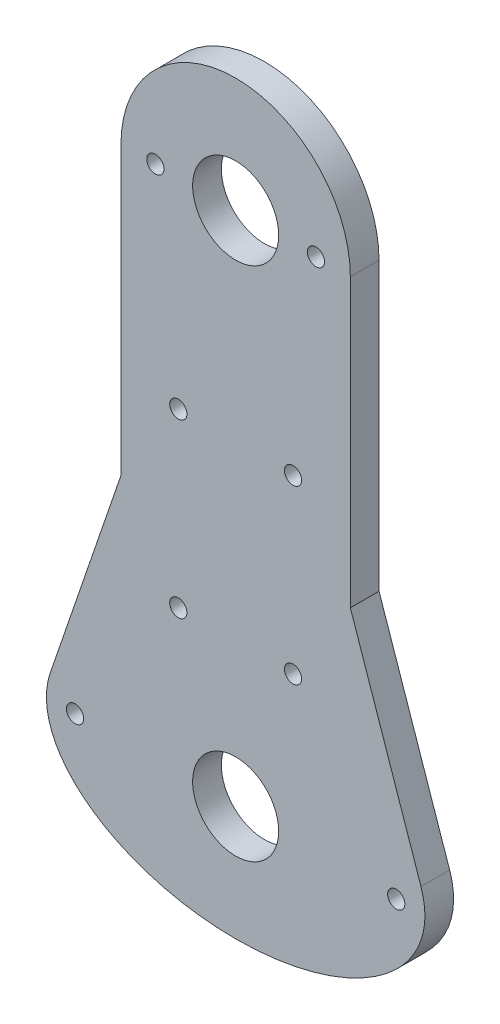
ISO-10303-21;
HEADER;
FILE_DESCRIPTION(('STEP AP214'),'2;1');
FILE_NAME('part.step','',(''),(''),'','','');
FILE_SCHEMA(('AUTOMOTIVE_DESIGN { 1 0 10303 214 1 1 1 1 }'));
ENDSEC;
DATA;
#1=APPLICATION_CONTEXT('core data for automotive mechanical design processes');
#2=APPLICATION_PROTOCOL_DEFINITION('international standard','automotive_design',2000,#1);
#3=PRODUCT_CONTEXT('',#1,'mechanical');
#4=PRODUCT('Part','Part','',(#3));
#5=PRODUCT_RELATED_PRODUCT_CATEGORY('part','',(#4));
#6=PRODUCT_DEFINITION_FORMATION('','',#4);
#7=PRODUCT_DEFINITION_CONTEXT('part definition',#1,'design');
#8=PRODUCT_DEFINITION('design','',#6,#7);
#9=PRODUCT_DEFINITION_SHAPE('','',#8);
#10=(LENGTH_UNIT() NAMED_UNIT(*) SI_UNIT(.MILLI.,.METRE.));
#11=(NAMED_UNIT(*) PLANE_ANGLE_UNIT() SI_UNIT($,.RADIAN.));
#12=(NAMED_UNIT(*) SI_UNIT($,.STERADIAN.) SOLID_ANGLE_UNIT());
#13=UNCERTAINTY_MEASURE_WITH_UNIT(LENGTH_MEASURE(1.E-05),#10,'distance_accuracy_value','');
#14=(GEOMETRIC_REPRESENTATION_CONTEXT(3) GLOBAL_UNCERTAINTY_ASSIGNED_CONTEXT((#13)) GLOBAL_UNIT_ASSIGNED_CONTEXT((#10,
#11,#12)) REPRESENTATION_CONTEXT('',''));
#15=CARTESIAN_POINT('',(0.,0.,0.));
#16=DIRECTION('',(0.,0.,1.));
#17=DIRECTION('',(1.,0.,0.));
#18=AXIS2_PLACEMENT_3D('',#15,#16,#17);
#19=CARTESIAN_POINT('',(2.5687062530529,0.880028463017288,5.));
#20=DIRECTION('',(0.946021715179054,0.324103246527525,0.));
#21=DIRECTION('',(-0.324103246527525,0.946021715179054,0.));
#22=AXIS2_PLACEMENT_3D('',#19,#20,#21);
#23=PLANE('',#22);
#24=DIRECTION('',(0.324103246527525,-0.946021715179054,0.));
#25=VECTOR('',#24,1.);
#26=CARTESIAN_POINT('',(2.5687062530529,0.880028463017288,0.));
#27=LINE('',#26,#25);
#28=CARTESIAN_POINT('',(20.,-50.,0.));
#29=VERTEX_POINT('',#28);
#30=CARTESIAN_POINT('',(32.3108587123528,-85.9340420041052,0.));
#31=VERTEX_POINT('',#30);
#32=EDGE_CURVE('E210',#29,#31,#27,.T.);
#33=ORIENTED_EDGE('',*,*,#32,.F.);
#34=DIRECTION('',(0.,0.,-1.));
#35=VECTOR('',#34,1.);
#36=CARTESIAN_POINT('',(20.,-50.,5.));
#37=LINE('',#36,#35);
#38=CARTESIAN_POINT('',(20.,-50.,5.));
#39=VERTEX_POINT('',#38);
#40=EDGE_CURVE('E73',#39,#29,#37,.T.);
#41=ORIENTED_EDGE('',*,*,#40,.F.);
#42=DIRECTION('',(-0.324103246527525,0.946021715179054,0.));
#43=VECTOR('',#42,1.);
#44=CARTESIAN_POINT('',(2.5687062530529,0.880028463017288,5.));
#45=LINE('',#44,#43);
#46=CARTESIAN_POINT('',(32.3108587123528,-85.9340420041052,5.));
#47=VERTEX_POINT('',#46);
#48=EDGE_CURVE('E140',#39,#47,#45,.F.);
#49=ORIENTED_EDGE('',*,*,#48,.T.);
#50=DIRECTION('',(0.,0.,-1.));
#51=VECTOR('',#50,1.);
#52=CARTESIAN_POINT('',(32.3108587123528,-85.9340420041052,5.));
#53=LINE('',#52,#51);
#54=EDGE_CURVE('E13',#47,#31,#53,.T.);
#55=ORIENTED_EDGE('',*,*,#54,.T.);
#56=EDGE_LOOP('',(#33,#41,#49,#55));
#57=FACE_BOUND('',#56,.T.);
#58=ADVANCED_FACE('F61',(#57),#23,.T.);
#59=CARTESIAN_POINT('',(20.,0.,5.));
#60=DIRECTION('',(1.,0.,0.));
#61=DIRECTION('',(0.,0.,-1.));
#62=AXIS2_PLACEMENT_3D('',#59,#60,#61);
#63=PLANE('',#62);
#64=DIRECTION('',(0.,-1.,0.));
#65=VECTOR('',#64,1.);
#66=CARTESIAN_POINT('',(20.,0.,0.));
#67=LINE('',#66,#65);
#68=CARTESIAN_POINT('',(20.,0.,0.));
#69=VERTEX_POINT('',#68);
#70=EDGE_CURVE('E214',#69,#29,#67,.T.);
#71=ORIENTED_EDGE('',*,*,#70,.F.);
#72=DIRECTION('',(0.,0.,-1.));
#73=VECTOR('',#72,1.);
#74=CARTESIAN_POINT('',(20.,0.,5.));
#75=LINE('',#74,#73);
#76=CARTESIAN_POINT('',(20.,0.,5.));
#77=VERTEX_POINT('',#76);
#78=EDGE_CURVE('E131',#77,#69,#75,.T.);
#79=ORIENTED_EDGE('',*,*,#78,.F.);
#80=DIRECTION('',(0.,1.,0.));
#81=VECTOR('',#80,1.);
#82=CARTESIAN_POINT('',(20.,0.,5.));
#83=LINE('',#82,#81);
#84=EDGE_CURVE('E121',#77,#39,#83,.F.);
#85=ORIENTED_EDGE('',*,*,#84,.T.);
#86=ORIENTED_EDGE('',*,*,#40,.T.);
#87=EDGE_LOOP('',(#71,#79,#85,#86));
#88=FACE_BOUND('',#87,.T.);
#89=ADVANCED_FACE('F201',(#88),#63,.T.);
#90=CARTESIAN_POINT('',(0.,0.,5.));
#91=DIRECTION('',(0.,0.,-1.));
#92=DIRECTION('',(-1.,0.,0.));
#93=AXIS2_PLACEMENT_3D('',#90,#91,#92);
#94=CYLINDRICAL_SURFACE('',#93,20.);
#95=CARTESIAN_POINT('',(0.,0.,0.));
#96=DIRECTION('',(0.,0.,1.));
#97=DIRECTION('',(1.,0.,0.));
#98=AXIS2_PLACEMENT_3D('',#95,#96,#97);
#99=CIRCLE('',#98,20.);
#100=CARTESIAN_POINT('',(-20.,0.,0.));
#101=VERTEX_POINT('',#100);
#102=EDGE_CURVE('E128',#69,#101,#99,.T.);
#103=ORIENTED_EDGE('',*,*,#102,.T.);
#104=DIRECTION('',(0.,0.,-1.));
#105=VECTOR('',#104,1.);
#106=CARTESIAN_POINT('',(-20.,0.,5.));
#107=LINE('',#106,#105);
#108=CARTESIAN_POINT('',(-20.,0.,5.));
#109=VERTEX_POINT('',#108);
#110=EDGE_CURVE('E125',#109,#101,#107,.T.);
#111=ORIENTED_EDGE('',*,*,#110,.F.);
#112=CARTESIAN_POINT('',(0.,0.,5.));
#113=DIRECTION('',(0.,0.,-1.));
#114=DIRECTION('',(-1.,0.,0.));
#115=AXIS2_PLACEMENT_3D('',#112,#113,#114);
#116=CIRCLE('',#115,20.);
#117=EDGE_CURVE('E113',#77,#109,#116,.F.);
#118=ORIENTED_EDGE('',*,*,#117,.F.);
#119=ORIENTED_EDGE('',*,*,#78,.T.);
#120=EDGE_LOOP('',(#103,#111,#118,#119));
#121=FACE_BOUND('',#120,.T.);
#122=ADVANCED_FACE('F126',(#121),#94,.T.);
#123=CARTESIAN_POINT('',(-20.,0.,5.));
#124=DIRECTION('',(1.,0.,0.));
#125=DIRECTION('',(0.,0.,-1.));
#126=AXIS2_PLACEMENT_3D('',#123,#124,#125);
#127=PLANE('',#126);
#128=DIRECTION('',(0.,-1.,0.));
#129=VECTOR('',#128,1.);
#130=CARTESIAN_POINT('',(-20.,0.,0.));
#131=LINE('',#130,#129);
#132=CARTESIAN_POINT('',(-20.,-50.,0.));
#133=VERTEX_POINT('',#132);
#134=EDGE_CURVE('E218',#101,#133,#131,.T.);
#135=ORIENTED_EDGE('',*,*,#134,.T.);
#136=DIRECTION('',(0.,0.,-1.));
#137=VECTOR('',#136,1.);
#138=CARTESIAN_POINT('',(-20.,-50.,5.));
#139=LINE('',#138,#137);
#140=CARTESIAN_POINT('',(-20.,-50.,5.));
#141=VERTEX_POINT('',#140);
#142=EDGE_CURVE('E132',#141,#133,#139,.T.);
#143=ORIENTED_EDGE('',*,*,#142,.F.);
#144=DIRECTION('',(0.,1.,0.));
#145=VECTOR('',#144,1.);
#146=CARTESIAN_POINT('',(-20.,0.,5.));
#147=LINE('',#146,#145);
#148=EDGE_CURVE('E117',#109,#141,#147,.F.);
#149=ORIENTED_EDGE('',*,*,#148,.F.);
#150=ORIENTED_EDGE('',*,*,#110,.T.);
#151=EDGE_LOOP('',(#135,#143,#149,#150));
#152=FACE_BOUND('',#151,.T.);
#153=ADVANCED_FACE('F134',(#152),#127,.F.);
#154=CARTESIAN_POINT('',(-2.5687062530529,0.880028463017288,5.));
#155=DIRECTION('',(0.946021715179054,-0.324103246527525,0.));
#156=DIRECTION('',(0.324103246527525,0.946021715179054,0.));
#157=AXIS2_PLACEMENT_3D('',#154,#155,#156);
#158=PLANE('',#157);
#159=DIRECTION('',(-0.324103246527525,-0.946021715179054,0.));
#160=VECTOR('',#159,1.);
#161=CARTESIAN_POINT('',(-2.5687062530529,0.880028463017288,0.));
#162=LINE('',#161,#160);
#163=CARTESIAN_POINT('',(-32.3108587123528,-85.9340420041052,0.));
#164=VERTEX_POINT('',#163);
#165=EDGE_CURVE('E222',#133,#164,#162,.T.);
#166=ORIENTED_EDGE('',*,*,#165,.T.);
#167=DIRECTION('',(0.,0.,-1.));
#168=VECTOR('',#167,1.);
#169=CARTESIAN_POINT('',(-32.3108587123528,-85.9340420041052,5.));
#170=LINE('',#169,#168);
#171=CARTESIAN_POINT('',(-32.3108587123528,-85.9340420041052,5.));
#172=VERTEX_POINT('',#171);
#173=EDGE_CURVE('E137',#172,#164,#170,.T.);
#174=ORIENTED_EDGE('',*,*,#173,.F.);
#175=DIRECTION('',(-0.324103246527525,-0.946021715179053,0.));
#176=VECTOR('',#175,1.);
#177=CARTESIAN_POINT('',(-20.,-50.,5.));
#178=LINE('',#177,#176);
#179=EDGE_CURVE('E81',#141,#172,#178,.T.);
#180=ORIENTED_EDGE('',*,*,#179,.F.);
#181=ORIENTED_EDGE('',*,*,#142,.T.);
#182=EDGE_LOOP('',(#166,#174,#180,#181));
#183=FACE_BOUND('',#182,.T.);
#184=ADVANCED_FACE('F193',(#183),#158,.F.);
#185=CARTESIAN_POINT('',(0.,-90.,5.));
#186=DIRECTION('',(0.,0.,1.));
#187=DIRECTION('',(-1.,0.,0.));
#188=AXIS2_PLACEMENT_3D('',#185,#186,#187);
#189=ELLIPSE('',#188,33.,20.);
#190=DIRECTION('',(0.,0.,-1.));
#191=VECTOR('',#190,1.);
#192=SURFACE_OF_LINEAR_EXTRUSION('',#189,#191);
#193=ORIENTED_EDGE('',*,*,#54,.F.);
#194=CARTESIAN_POINT('',(0.,-90.,5.));
#195=DIRECTION('',(0.,0.,-1.));
#196=DIRECTION('',(-1.,0.,0.));
#197=AXIS2_PLACEMENT_3D('',#194,#195,#196);
#198=ELLIPSE('',#197,33.,20.);
#199=EDGE_CURVE('E145',#172,#47,#198,.F.);
#200=ORIENTED_EDGE('',*,*,#199,.F.);
#201=ORIENTED_EDGE('',*,*,#173,.T.);
#202=CARTESIAN_POINT('',(0.,-90.,0.));
#203=DIRECTION('',(0.,0.,1.));
#204=DIRECTION('',(-1.,0.,0.));
#205=AXIS2_PLACEMENT_3D('',#202,#203,#204);
#206=ELLIPSE('',#205,33.,20.);
#207=EDGE_CURVE('E152',#164,#31,#206,.T.);
#208=ORIENTED_EDGE('',*,*,#207,.T.);
#209=EDGE_LOOP('',(#193,#200,#201,#208));
#210=FACE_BOUND('',#209,.T.);
#211=ADVANCED_FACE('F63',(#210),#192,.F.);
#212=CARTESIAN_POINT('',(0.,0.,0.));
#213=DIRECTION('',(0.,0.,1.));
#214=DIRECTION('',(1.,0.,0.));
#215=AXIS2_PLACEMENT_3D('',#212,#213,#214);
#216=PLANE('',#215);
#217=CARTESIAN_POINT('',(28.,-90.,0.));
#218=DIRECTION('',(0.,0.,1.));
#219=DIRECTION('',(1.,0.,0.));
#220=AXIS2_PLACEMENT_3D('',#217,#218,#219);
#221=CIRCLE('',#220,1.5);
#222=CARTESIAN_POINT('',(29.5,-90.,0.));
#223=VERTEX_POINT('',#222);
#224=EDGE_CURVE('E234',#223,#223,#221,.F.);
#225=ORIENTED_EDGE('',*,*,#224,.F.);
#226=EDGE_LOOP('',(#225));
#227=FACE_BOUND('',#226,.T.);
#228=CARTESIAN_POINT('',(-28.,-90.,0.));
#229=DIRECTION('',(0.,0.,1.));
#230=DIRECTION('',(1.,0.,0.));
#231=AXIS2_PLACEMENT_3D('',#228,#229,#230);
#232=CIRCLE('',#231,1.5);
#233=CARTESIAN_POINT('',(-26.5,-90.,0.));
#234=VERTEX_POINT('',#233);
#235=EDGE_CURVE('E265',#234,#234,#232,.F.);
#236=ORIENTED_EDGE('',*,*,#235,.F.);
#237=EDGE_LOOP('',(#236));
#238=FACE_BOUND('',#237,.T.);
#239=CARTESIAN_POINT('',(-10.,-65.,0.));
#240=DIRECTION('',(0.,0.,1.));
#241=DIRECTION('',(1.,0.,0.));
#242=AXIS2_PLACEMENT_3D('',#239,#240,#241);
#243=CIRCLE('',#242,1.5);
#244=CARTESIAN_POINT('',(-8.50000000000003,-65.,0.));
#245=VERTEX_POINT('',#244);
#246=EDGE_CURVE('E264',#245,#245,#243,.F.);
#247=ORIENTED_EDGE('',*,*,#246,.F.);
#248=EDGE_LOOP('',(#247));
#249=FACE_BOUND('',#248,.T.);
#250=CARTESIAN_POINT('',(-10.,-35.,0.));
#251=DIRECTION('',(0.,0.,1.));
#252=DIRECTION('',(1.,0.,0.));
#253=AXIS2_PLACEMENT_3D('',#250,#251,#252);
#254=CIRCLE('',#253,1.5);
#255=CARTESIAN_POINT('',(-8.5,-35.,0.));
#256=VERTEX_POINT('',#255);
#257=EDGE_CURVE('E271',#256,#256,#254,.F.);
#258=ORIENTED_EDGE('',*,*,#257,.F.);
#259=EDGE_LOOP('',(#258));
#260=FACE_BOUND('',#259,.T.);
#261=CARTESIAN_POINT('',(14.,0.,0.));
#262=DIRECTION('',(0.,0.,1.));
#263=DIRECTION('',(1.,0.,0.));
#264=AXIS2_PLACEMENT_3D('',#261,#262,#263);
#265=CIRCLE('',#264,1.5);
#266=CARTESIAN_POINT('',(15.5,0.,0.));
#267=VERTEX_POINT('',#266);
#268=EDGE_CURVE('E238',#267,#267,#265,.F.);
#269=ORIENTED_EDGE('',*,*,#268,.F.);
#270=EDGE_LOOP('',(#269));
#271=FACE_BOUND('',#270,.T.);
#272=CARTESIAN_POINT('',(10.,-35.,0.));
#273=DIRECTION('',(0.,0.,1.));
#274=DIRECTION('',(1.,0.,0.));
#275=AXIS2_PLACEMENT_3D('',#272,#273,#274);
#276=CIRCLE('',#275,1.5);
#277=CARTESIAN_POINT('',(11.5,-35.,0.));
#278=VERTEX_POINT('',#277);
#279=EDGE_CURVE('E239',#278,#278,#276,.F.);
#280=ORIENTED_EDGE('',*,*,#279,.F.);
#281=EDGE_LOOP('',(#280));
#282=FACE_BOUND('',#281,.T.);
#283=CARTESIAN_POINT('',(10.,-65.,0.));
#284=DIRECTION('',(0.,0.,1.));
#285=DIRECTION('',(1.,0.,0.));
#286=AXIS2_PLACEMENT_3D('',#283,#284,#285);
#287=CIRCLE('',#286,1.5);
#288=CARTESIAN_POINT('',(11.5,-65.,0.));
#289=VERTEX_POINT('',#288);
#290=EDGE_CURVE('E252',#289,#289,#287,.F.);
#291=ORIENTED_EDGE('',*,*,#290,.F.);
#292=EDGE_LOOP('',(#291));
#293=FACE_BOUND('',#292,.T.);
#294=CARTESIAN_POINT('',(-14.,0.,0.));
#295=DIRECTION('',(0.,0.,1.));
#296=DIRECTION('',(1.,0.,0.));
#297=AXIS2_PLACEMENT_3D('',#294,#295,#296);
#298=CIRCLE('',#297,1.5);
#299=CARTESIAN_POINT('',(-12.5,0.,0.));
#300=VERTEX_POINT('',#299);
#301=EDGE_CURVE('E253',#300,#300,#298,.F.);
#302=ORIENTED_EDGE('',*,*,#301,.F.);
#303=EDGE_LOOP('',(#302));
#304=FACE_BOUND('',#303,.T.);
#305=CARTESIAN_POINT('',(0.,0.,0.));
#306=DIRECTION('',(0.,0.,1.));
#307=DIRECTION('',(1.,0.,0.));
#308=AXIS2_PLACEMENT_3D('',#305,#306,#307);
#309=CIRCLE('',#308,7.5);
#310=CARTESIAN_POINT('',(7.5,0.,0.));
#311=VERTEX_POINT('',#310);
#312=EDGE_CURVE('E228',#311,#311,#309,.T.);
#313=ORIENTED_EDGE('',*,*,#312,.T.);
#314=EDGE_LOOP('',(#313));
#315=FACE_BOUND('',#314,.T.);
#316=CARTESIAN_POINT('',(0.,-90.,0.));
#317=DIRECTION('',(0.,0.,1.));
#318=DIRECTION('',(1.,0.,0.));
#319=AXIS2_PLACEMENT_3D('',#316,#317,#318);
#320=CIRCLE('',#319,7.5);
#321=CARTESIAN_POINT('',(7.5,-90.,0.));
#322=VERTEX_POINT('',#321);
#323=EDGE_CURVE('E153',#322,#322,#320,.T.);
#324=ORIENTED_EDGE('',*,*,#323,.T.);
#325=EDGE_LOOP('',(#324));
#326=FACE_BOUND('',#325,.T.);
#327=ORIENTED_EDGE('',*,*,#32,.T.);
#328=ORIENTED_EDGE('',*,*,#207,.F.);
#329=ORIENTED_EDGE('',*,*,#165,.F.);
#330=ORIENTED_EDGE('',*,*,#134,.F.);
#331=ORIENTED_EDGE('',*,*,#102,.F.);
#332=ORIENTED_EDGE('',*,*,#70,.T.);
#333=EDGE_LOOP('',(#327,#328,#329,#330,#331,#332));
#334=FACE_BOUND('',#333,.T.);
#335=ADVANCED_FACE('F187',(#227,#238,#249,#260,#271,#282,#293,#304,#315,#326,#334),#216,.F.);
#336=CARTESIAN_POINT('',(0.,0.,5.));
#337=DIRECTION('',(0.,0.,1.));
#338=DIRECTION('',(1.,0.,0.));
#339=AXIS2_PLACEMENT_3D('',#336,#337,#338);
#340=PLANE('',#339);
#341=CARTESIAN_POINT('',(28.,-90.,5.));
#342=DIRECTION('',(0.,0.,1.));
#343=DIRECTION('',(1.,0.,0.));
#344=AXIS2_PLACEMENT_3D('',#341,#342,#343);
#345=CIRCLE('',#344,1.5);
#346=CARTESIAN_POINT('',(29.5,-90.,5.));
#347=VERTEX_POINT('',#346);
#348=EDGE_CURVE('E246',#347,#347,#345,.T.);
#349=ORIENTED_EDGE('',*,*,#348,.F.);
#350=EDGE_LOOP('',(#349));
#351=FACE_BOUND('',#350,.T.);
#352=CARTESIAN_POINT('',(-28.,-90.,5.));
#353=DIRECTION('',(0.,0.,1.));
#354=DIRECTION('',(-1.,0.,0.));
#355=AXIS2_PLACEMENT_3D('',#352,#353,#354);
#356=CIRCLE('',#355,1.5);
#357=CARTESIAN_POINT('',(-29.5,-90.,5.));
#358=VERTEX_POINT('',#357);
#359=EDGE_CURVE('E261',#358,#358,#356,.T.);
#360=ORIENTED_EDGE('',*,*,#359,.F.);
#361=EDGE_LOOP('',(#360));
#362=FACE_BOUND('',#361,.T.);
#363=CARTESIAN_POINT('',(-10.,-65.,5.));
#364=DIRECTION('',(0.,0.,1.));
#365=DIRECTION('',(-1.,0.,0.));
#366=AXIS2_PLACEMENT_3D('',#363,#364,#365);
#367=CIRCLE('',#366,1.5);
#368=CARTESIAN_POINT('',(-11.5,-65.,5.));
#369=VERTEX_POINT('',#368);
#370=EDGE_CURVE('E268',#369,#369,#367,.T.);
#371=ORIENTED_EDGE('',*,*,#370,.F.);
#372=EDGE_LOOP('',(#371));
#373=FACE_BOUND('',#372,.T.);
#374=CARTESIAN_POINT('',(-10.,-35.,5.));
#375=DIRECTION('',(0.,0.,1.));
#376=DIRECTION('',(-1.,0.,0.));
#377=AXIS2_PLACEMENT_3D('',#374,#375,#376);
#378=CIRCLE('',#377,1.5);
#379=CARTESIAN_POINT('',(-11.5,-35.,5.));
#380=VERTEX_POINT('',#379);
#381=EDGE_CURVE('E256',#380,#380,#378,.T.);
#382=ORIENTED_EDGE('',*,*,#381,.F.);
#383=EDGE_LOOP('',(#382));
#384=FACE_BOUND('',#383,.T.);
#385=CARTESIAN_POINT('',(14.,0.,5.));
#386=DIRECTION('',(0.,0.,1.));
#387=DIRECTION('',(1.,0.,0.));
#388=AXIS2_PLACEMENT_3D('',#385,#386,#387);
#389=CIRCLE('',#388,1.5);
#390=CARTESIAN_POINT('',(15.5,0.,5.));
#391=VERTEX_POINT('',#390);
#392=EDGE_CURVE('E243',#391,#391,#389,.T.);
#393=ORIENTED_EDGE('',*,*,#392,.F.);
#394=EDGE_LOOP('',(#393));
#395=FACE_BOUND('',#394,.T.);
#396=CARTESIAN_POINT('',(10.,-35.,5.));
#397=DIRECTION('',(0.,0.,1.));
#398=DIRECTION('',(1.,0.,0.));
#399=AXIS2_PLACEMENT_3D('',#396,#397,#398);
#400=CIRCLE('',#399,1.5);
#401=CARTESIAN_POINT('',(11.5,-35.,5.));
#402=VERTEX_POINT('',#401);
#403=EDGE_CURVE('E235',#402,#402,#400,.T.);
#404=ORIENTED_EDGE('',*,*,#403,.F.);
#405=EDGE_LOOP('',(#404));
#406=FACE_BOUND('',#405,.T.);
#407=CARTESIAN_POINT('',(10.,-65.,5.));
#408=DIRECTION('',(0.,0.,1.));
#409=DIRECTION('',(1.,0.,0.));
#410=AXIS2_PLACEMENT_3D('',#407,#408,#409);
#411=CIRCLE('',#410,1.5);
#412=CARTESIAN_POINT('',(11.5,-65.,5.));
#413=VERTEX_POINT('',#412);
#414=EDGE_CURVE('E242',#413,#413,#411,.T.);
#415=ORIENTED_EDGE('',*,*,#414,.F.);
#416=EDGE_LOOP('',(#415));
#417=FACE_BOUND('',#416,.T.);
#418=CARTESIAN_POINT('',(-14.,0.,5.));
#419=DIRECTION('',(0.,0.,1.));
#420=DIRECTION('',(-1.,0.,0.));
#421=AXIS2_PLACEMENT_3D('',#418,#419,#420);
#422=CIRCLE('',#421,1.5);
#423=CARTESIAN_POINT('',(-15.5,0.,5.));
#424=VERTEX_POINT('',#423);
#425=EDGE_CURVE('E249',#424,#424,#422,.T.);
#426=ORIENTED_EDGE('',*,*,#425,.F.);
#427=EDGE_LOOP('',(#426));
#428=FACE_BOUND('',#427,.T.);
#429=CARTESIAN_POINT('',(0.,0.,5.));
#430=DIRECTION('',(0.,0.,1.));
#431=DIRECTION('',(1.,0.,0.));
#432=AXIS2_PLACEMENT_3D('',#429,#430,#431);
#433=CIRCLE('',#432,7.5);
#434=CARTESIAN_POINT('',(7.5,0.,5.));
#435=VERTEX_POINT('',#434);
#436=EDGE_CURVE('E231',#435,#435,#433,.T.);
#437=ORIENTED_EDGE('',*,*,#436,.F.);
#438=EDGE_LOOP('',(#437));
#439=FACE_BOUND('',#438,.T.);
#440=CARTESIAN_POINT('',(0.,-90.,5.));
#441=DIRECTION('',(0.,0.,1.));
#442=DIRECTION('',(1.,0.,0.));
#443=AXIS2_PLACEMENT_3D('',#440,#441,#442);
#444=CIRCLE('',#443,7.5);
#445=CARTESIAN_POINT('',(7.5,-90.,5.));
#446=VERTEX_POINT('',#445);
#447=EDGE_CURVE('E149',#446,#446,#444,.T.);
#448=ORIENTED_EDGE('',*,*,#447,.F.);
#449=EDGE_LOOP('',(#448));
#450=FACE_BOUND('',#449,.T.);
#451=ORIENTED_EDGE('',*,*,#199,.T.);
#452=ORIENTED_EDGE('',*,*,#48,.F.);
#453=ORIENTED_EDGE('',*,*,#84,.F.);
#454=ORIENTED_EDGE('',*,*,#117,.T.);
#455=ORIENTED_EDGE('',*,*,#148,.T.);
#456=ORIENTED_EDGE('',*,*,#179,.T.);
#457=EDGE_LOOP('',(#451,#452,#453,#454,#455,#456));
#458=FACE_BOUND('',#457,.T.);
#459=ADVANCED_FACE('F115',(#351,#362,#373,#384,#395,#406,#417,#428,#439,#450,#458),#340,.T.);
#460=CARTESIAN_POINT('',(0.,-90.,0.));
#461=DIRECTION('',(0.,0.,1.));
#462=DIRECTION('',(1.,0.,0.));
#463=AXIS2_PLACEMENT_3D('',#460,#461,#462);
#464=CYLINDRICAL_SURFACE('',#463,7.5);
#465=ORIENTED_EDGE('',*,*,#447,.T.);
#466=EDGE_LOOP('',(#465));
#467=FACE_BOUND('',#466,.T.);
#468=ORIENTED_EDGE('',*,*,#323,.F.);
#469=EDGE_LOOP('',(#468));
#470=FACE_BOUND('',#469,.T.);
#471=ADVANCED_FACE('F186',(#467,#470),#464,.F.);
#472=CARTESIAN_POINT('',(0.,0.,-2.49999999998515E-05));
#473=DIRECTION('',(0.,0.,1.));
#474=DIRECTION('',(1.,0.,0.));
#475=AXIS2_PLACEMENT_3D('',#472,#473,#474);
#476=CYLINDRICAL_SURFACE('',#475,7.5);
#477=ORIENTED_EDGE('',*,*,#436,.T.);
#478=EDGE_LOOP('',(#477));
#479=FACE_BOUND('',#478,.T.);
#480=ORIENTED_EDGE('',*,*,#312,.F.);
#481=EDGE_LOOP('',(#480));
#482=FACE_BOUND('',#481,.T.);
#483=ADVANCED_FACE('F305',(#479,#482),#476,.F.);
#484=CARTESIAN_POINT('',(-14.,0.,-4.24264068711929));
#485=DIRECTION('',(0.,0.,1.));
#486=DIRECTION('',(1.,0.,0.));
#487=AXIS2_PLACEMENT_3D('',#484,#485,#486);
#488=CYLINDRICAL_SURFACE('',#487,1.5);
#489=ORIENTED_EDGE('',*,*,#301,.T.);
#490=EDGE_LOOP('',(#489));
#491=FACE_BOUND('',#490,.T.);
#492=ORIENTED_EDGE('',*,*,#425,.T.);
#493=EDGE_LOOP('',(#492));
#494=FACE_BOUND('',#493,.T.);
#495=ADVANCED_FACE('F311',(#491,#494),#488,.F.);
#496=CARTESIAN_POINT('',(10.,-65.,-4.24264068711929));
#497=DIRECTION('',(0.,0.,1.));
#498=DIRECTION('',(1.,0.,0.));
#499=AXIS2_PLACEMENT_3D('',#496,#497,#498);
#500=CYLINDRICAL_SURFACE('',#499,1.5);
#501=ORIENTED_EDGE('',*,*,#290,.T.);
#502=EDGE_LOOP('',(#501));
#503=FACE_BOUND('',#502,.T.);
#504=ORIENTED_EDGE('',*,*,#414,.T.);
#505=EDGE_LOOP('',(#504));
#506=FACE_BOUND('',#505,.T.);
#507=ADVANCED_FACE('F316',(#503,#506),#500,.F.);
#508=CARTESIAN_POINT('',(10.,-35.,-4.24264068711929));
#509=DIRECTION('',(0.,0.,1.));
#510=DIRECTION('',(1.,0.,0.));
#511=AXIS2_PLACEMENT_3D('',#508,#509,#510);
#512=CYLINDRICAL_SURFACE('',#511,1.5);
#513=ORIENTED_EDGE('',*,*,#279,.T.);
#514=EDGE_LOOP('',(#513));
#515=FACE_BOUND('',#514,.T.);
#516=ORIENTED_EDGE('',*,*,#403,.T.);
#517=EDGE_LOOP('',(#516));
#518=FACE_BOUND('',#517,.T.);
#519=ADVANCED_FACE('F321',(#515,#518),#512,.F.);
#520=CARTESIAN_POINT('',(14.,0.,-4.24264068711929));
#521=DIRECTION('',(0.,0.,1.));
#522=DIRECTION('',(1.,0.,0.));
#523=AXIS2_PLACEMENT_3D('',#520,#521,#522);
#524=CYLINDRICAL_SURFACE('',#523,1.5);
#525=ORIENTED_EDGE('',*,*,#268,.T.);
#526=EDGE_LOOP('',(#525));
#527=FACE_BOUND('',#526,.T.);
#528=ORIENTED_EDGE('',*,*,#392,.T.);
#529=EDGE_LOOP('',(#528));
#530=FACE_BOUND('',#529,.T.);
#531=ADVANCED_FACE('F324',(#527,#530),#524,.F.);
#532=CARTESIAN_POINT('',(-10.,-35.,-4.24264068711929));
#533=DIRECTION('',(0.,0.,1.));
#534=DIRECTION('',(1.,0.,0.));
#535=AXIS2_PLACEMENT_3D('',#532,#533,#534);
#536=CYLINDRICAL_SURFACE('',#535,1.5);
#537=ORIENTED_EDGE('',*,*,#257,.T.);
#538=EDGE_LOOP('',(#537));
#539=FACE_BOUND('',#538,.T.);
#540=ORIENTED_EDGE('',*,*,#381,.T.);
#541=EDGE_LOOP('',(#540));
#542=FACE_BOUND('',#541,.T.);
#543=ADVANCED_FACE('F327',(#539,#542),#536,.F.);
#544=CARTESIAN_POINT('',(-10.,-65.,-4.24264068711929));
#545=DIRECTION('',(0.,0.,1.));
#546=DIRECTION('',(1.,0.,0.));
#547=AXIS2_PLACEMENT_3D('',#544,#545,#546);
#548=CYLINDRICAL_SURFACE('',#547,1.5);
#549=ORIENTED_EDGE('',*,*,#246,.T.);
#550=EDGE_LOOP('',(#549));
#551=FACE_BOUND('',#550,.T.);
#552=ORIENTED_EDGE('',*,*,#370,.T.);
#553=EDGE_LOOP('',(#552));
#554=FACE_BOUND('',#553,.T.);
#555=ADVANCED_FACE('F336',(#551,#554),#548,.F.);
#556=CARTESIAN_POINT('',(-28.,-90.,-4.24264068711929));
#557=DIRECTION('',(0.,0.,1.));
#558=DIRECTION('',(1.,0.,0.));
#559=AXIS2_PLACEMENT_3D('',#556,#557,#558);
#560=CYLINDRICAL_SURFACE('',#559,1.5);
#561=ORIENTED_EDGE('',*,*,#235,.T.);
#562=EDGE_LOOP('',(#561));
#563=FACE_BOUND('',#562,.T.);
#564=ORIENTED_EDGE('',*,*,#359,.T.);
#565=EDGE_LOOP('',(#564));
#566=FACE_BOUND('',#565,.T.);
#567=ADVANCED_FACE('F333',(#563,#566),#560,.F.);
#568=CARTESIAN_POINT('',(28.,-90.,-4.24264068711929));
#569=DIRECTION('',(0.,0.,1.));
#570=DIRECTION('',(1.,0.,0.));
#571=AXIS2_PLACEMENT_3D('',#568,#569,#570);
#572=CYLINDRICAL_SURFACE('',#571,1.5);
#573=ORIENTED_EDGE('',*,*,#224,.T.);
#574=EDGE_LOOP('',(#573));
#575=FACE_BOUND('',#574,.T.);
#576=ORIENTED_EDGE('',*,*,#348,.T.);
#577=EDGE_LOOP('',(#576));
#578=FACE_BOUND('',#577,.T.);
#579=ADVANCED_FACE('F283',(#575,#578),#572,.F.);
#580=CLOSED_SHELL('',(#58,#89,#122,#153,#184,#211,#335,#459,#471,#483,#495,#507,#519,#531,#543,
#555,#567,#579));
#581=MANIFOLD_SOLID_BREP('B2',#580);
#582=ADVANCED_BREP_SHAPE_REPRESENTATION('',(#18,#581),#14);
#583=SHAPE_DEFINITION_REPRESENTATION(#9,#582);
ENDSEC;
END-ISO-10303-21;
